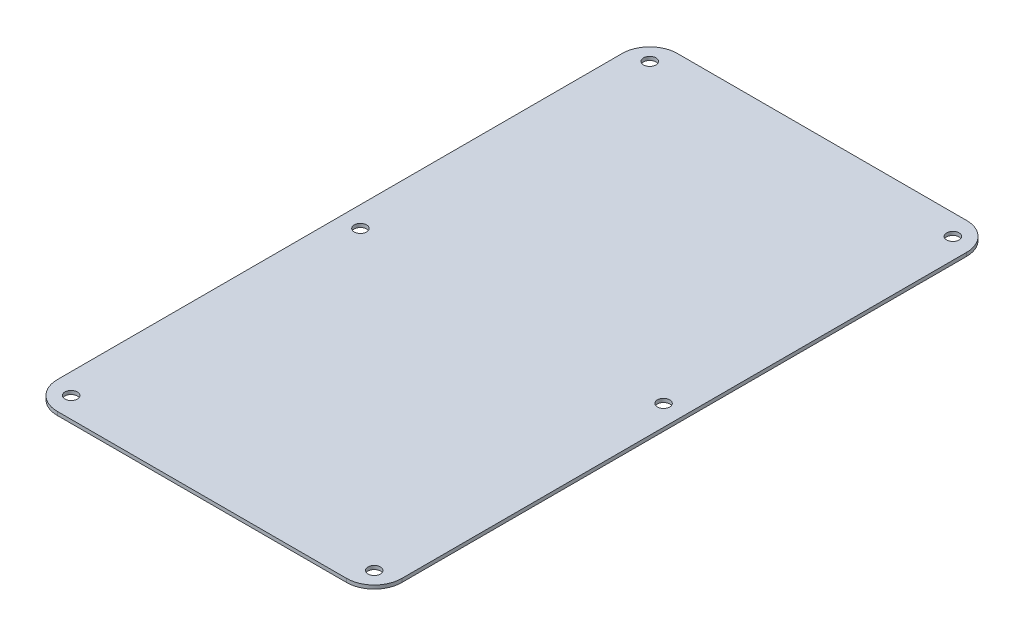
ISO-10303-21;
HEADER;
FILE_DESCRIPTION(('STEP AP214'),'2;1');
FILE_NAME('part.step','',(''),(''),'','','');
FILE_SCHEMA(('AUTOMOTIVE_DESIGN { 1 0 10303 214 1 1 1 1 }'));
ENDSEC;
DATA;
#1=APPLICATION_CONTEXT('core data for automotive mechanical design processes');
#2=APPLICATION_PROTOCOL_DEFINITION('international standard','automotive_design',2000,#1);
#3=PRODUCT_CONTEXT('',#1,'mechanical');
#4=PRODUCT('Part','Part','',(#3));
#5=PRODUCT_RELATED_PRODUCT_CATEGORY('part','',(#4));
#6=PRODUCT_DEFINITION_FORMATION('','',#4);
#7=PRODUCT_DEFINITION_CONTEXT('part definition',#1,'design');
#8=PRODUCT_DEFINITION('design','',#6,#7);
#9=PRODUCT_DEFINITION_SHAPE('','',#8);
#10=(LENGTH_UNIT() NAMED_UNIT(*) SI_UNIT(.MILLI.,.METRE.));
#11=(NAMED_UNIT(*) PLANE_ANGLE_UNIT() SI_UNIT($,.RADIAN.));
#12=(NAMED_UNIT(*) SI_UNIT($,.STERADIAN.) SOLID_ANGLE_UNIT());
#13=UNCERTAINTY_MEASURE_WITH_UNIT(LENGTH_MEASURE(1.E-05),#10,'distance_accuracy_value','');
#14=(GEOMETRIC_REPRESENTATION_CONTEXT(3) GLOBAL_UNCERTAINTY_ASSIGNED_CONTEXT((#13)) GLOBAL_UNIT_ASSIGNED_CONTEXT((#10,
#11,#12)) REPRESENTATION_CONTEXT('',''));
#15=CARTESIAN_POINT('',(0.,0.,0.));
#16=DIRECTION('',(0.,0.,1.));
#17=DIRECTION('',(1.,0.,0.));
#18=AXIS2_PLACEMENT_3D('',#15,#16,#17);
#19=CARTESIAN_POINT('',(61.3121302892401,-1.3,-121.883580575362));
#20=DIRECTION('',(1.,0.,0.));
#21=DIRECTION('',(0.,0.,-1.));
#22=AXIS2_PLACEMENT_3D('',#19,#20,#21);
#23=PLANE('',#22);
#24=DIRECTION('',(0.,0.,-1.));
#25=VECTOR('',#24,1.);
#26=CARTESIAN_POINT('',(61.3121302892401,-1.3,-121.883580575362));
#27=LINE('',#26,#25);
#28=CARTESIAN_POINT('',(61.3121302892401,-1.3,93.1164194246375));
#29=VERTEX_POINT('',#28);
#30=CARTESIAN_POINT('',(61.3121302892401,-1.3,-111.883580575362));
#31=VERTEX_POINT('',#30);
#32=EDGE_CURVE('E164',#29,#31,#27,.T.);
#33=ORIENTED_EDGE('',*,*,#32,.T.);
#34=DIRECTION('',(0.,1.,0.));
#35=VECTOR('',#34,1.);
#36=CARTESIAN_POINT('',(61.3121302892401,-1.3,-111.883580575362));
#37=LINE('',#36,#35);
#38=CARTESIAN_POINT('',(61.3121302892401,0.,-111.883580575362));
#39=VERTEX_POINT('',#38);
#40=EDGE_CURVE('E157',#31,#39,#37,.T.);
#41=ORIENTED_EDGE('',*,*,#40,.T.);
#42=DIRECTION('',(0.,0.,-1.));
#43=VECTOR('',#42,1.);
#44=CARTESIAN_POINT('',(61.3121302892401,0.,-121.883580575362));
#45=LINE('',#44,#43);
#46=CARTESIAN_POINT('',(61.3121302892401,0.,93.1164194246375));
#47=VERTEX_POINT('',#46);
#48=EDGE_CURVE('E110',#47,#39,#45,.T.);
#49=ORIENTED_EDGE('',*,*,#48,.F.);
#50=DIRECTION('',(0.,1.,0.));
#51=VECTOR('',#50,1.);
#52=CARTESIAN_POINT('',(61.3121302892401,-1.3,93.1164194246375));
#53=LINE('',#52,#51);
#54=EDGE_CURVE('E155',#47,#29,#53,.F.);
#55=ORIENTED_EDGE('',*,*,#54,.T.);
#56=EDGE_LOOP('',(#33,#41,#49,#55));
#57=FACE_BOUND('',#56,.T.);
#58=ADVANCED_FACE('F40',(#57),#23,.T.);
#59=CARTESIAN_POINT('',(-63.6878697107599,-1.3,103.116419424638));
#60=DIRECTION('',(0.,0.,1.));
#61=DIRECTION('',(1.,0.,0.));
#62=AXIS2_PLACEMENT_3D('',#59,#60,#61);
#63=PLANE('',#62);
#64=DIRECTION('',(1.,0.,0.));
#65=VECTOR('',#64,1.);
#66=CARTESIAN_POINT('',(-63.6878697107599,0.,103.116419424638));
#67=LINE('',#66,#65);
#68=CARTESIAN_POINT('',(-53.6878697107599,0.,103.116419424638));
#69=VERTEX_POINT('',#68);
#70=CARTESIAN_POINT('',(51.3121302892401,0.,103.116419424638));
#71=VERTEX_POINT('',#70);
#72=EDGE_CURVE('E138',#69,#71,#67,.T.);
#73=ORIENTED_EDGE('',*,*,#72,.F.);
#74=DIRECTION('',(0.,1.,0.));
#75=VECTOR('',#74,1.);
#76=CARTESIAN_POINT('',(-53.6878697107599,-1.3,103.116419424638));
#77=LINE('',#76,#75);
#78=CARTESIAN_POINT('',(-53.6878697107599,-1.3,103.116419424638));
#79=VERTEX_POINT('',#78);
#80=EDGE_CURVE('E11',#69,#79,#77,.F.);
#81=ORIENTED_EDGE('',*,*,#80,.T.);
#82=DIRECTION('',(1.,0.,0.));
#83=VECTOR('',#82,1.);
#84=CARTESIAN_POINT('',(-63.6878697107599,-1.3,103.116419424638));
#85=LINE('',#84,#83);
#86=CARTESIAN_POINT('',(51.3121302892401,-1.3,103.116419424638));
#87=VERTEX_POINT('',#86);
#88=EDGE_CURVE('E131',#79,#87,#85,.T.);
#89=ORIENTED_EDGE('',*,*,#88,.T.);
#90=DIRECTION('',(0.,1.,0.));
#91=VECTOR('',#90,1.);
#92=CARTESIAN_POINT('',(51.3121302892401,-1.3,103.116419424638));
#93=LINE('',#92,#91);
#94=EDGE_CURVE('E48',#87,#71,#93,.T.);
#95=ORIENTED_EDGE('',*,*,#94,.T.);
#96=EDGE_LOOP('',(#73,#81,#89,#95));
#97=FACE_BOUND('',#96,.T.);
#98=ADVANCED_FACE('F161',(#97),#63,.T.);
#99=CARTESIAN_POINT('',(-63.6878697107599,-1.3,-121.883580575362));
#100=DIRECTION('',(-1.,0.,0.));
#101=DIRECTION('',(0.,0.,1.));
#102=AXIS2_PLACEMENT_3D('',#99,#100,#101);
#103=PLANE('',#102);
#104=DIRECTION('',(0.,0.,1.));
#105=VECTOR('',#104,1.);
#106=CARTESIAN_POINT('',(-63.6878697107599,0.,-121.883580575362));
#107=LINE('',#106,#105);
#108=CARTESIAN_POINT('',(-63.6878697107599,0.,-111.883580575362));
#109=VERTEX_POINT('',#108);
#110=CARTESIAN_POINT('',(-63.6878697107599,0.,93.1164194246375));
#111=VERTEX_POINT('',#110);
#112=EDGE_CURVE('E126',#109,#111,#107,.T.);
#113=ORIENTED_EDGE('',*,*,#112,.F.);
#114=DIRECTION('',(0.,1.,0.));
#115=VECTOR('',#114,1.);
#116=CARTESIAN_POINT('',(-63.6878697107599,-1.3,-111.883580575362));
#117=LINE('',#116,#115);
#118=CARTESIAN_POINT('',(-63.6878697107599,-1.3,-111.883580575362));
#119=VERTEX_POINT('',#118);
#120=EDGE_CURVE('E147',#109,#119,#117,.F.);
#121=ORIENTED_EDGE('',*,*,#120,.T.);
#122=DIRECTION('',(0.,0.,1.));
#123=VECTOR('',#122,1.);
#124=CARTESIAN_POINT('',(-63.6878697107599,-1.3,-121.883580575362));
#125=LINE('',#124,#123);
#126=CARTESIAN_POINT('',(-63.6878697107599,-1.3,93.1164194246375));
#127=VERTEX_POINT('',#126);
#128=EDGE_CURVE('E135',#119,#127,#125,.T.);
#129=ORIENTED_EDGE('',*,*,#128,.T.);
#130=DIRECTION('',(0.,1.,0.));
#131=VECTOR('',#130,1.);
#132=CARTESIAN_POINT('',(-63.6878697107599,-1.3,93.1164194246375));
#133=LINE('',#132,#131);
#134=EDGE_CURVE('E144',#127,#111,#133,.T.);
#135=ORIENTED_EDGE('',*,*,#134,.T.);
#136=EDGE_LOOP('',(#113,#121,#129,#135));
#137=FACE_BOUND('',#136,.T.);
#138=ADVANCED_FACE('F246',(#137),#103,.T.);
#139=CARTESIAN_POINT('',(-63.6878697107599,-1.3,-121.883580575362));
#140=DIRECTION('',(0.,0.,-1.));
#141=DIRECTION('',(-1.,0.,0.));
#142=AXIS2_PLACEMENT_3D('',#139,#140,#141);
#143=PLANE('',#142);
#144=DIRECTION('',(-1.,0.,0.));
#145=VECTOR('',#144,1.);
#146=CARTESIAN_POINT('',(-63.6878697107599,-1.3,-121.883580575362));
#147=LINE('',#146,#145);
#148=CARTESIAN_POINT('',(51.3121302892401,-1.3,-121.883580575362));
#149=VERTEX_POINT('',#148);
#150=CARTESIAN_POINT('',(-53.6878697107599,-1.3,-121.883580575362));
#151=VERTEX_POINT('',#150);
#152=EDGE_CURVE('E166',#149,#151,#147,.T.);
#153=ORIENTED_EDGE('',*,*,#152,.T.);
#154=DIRECTION('',(0.,1.,0.));
#155=VECTOR('',#154,1.);
#156=CARTESIAN_POINT('',(-53.6878697107599,-1.3,-121.883580575362));
#157=LINE('',#156,#155);
#158=CARTESIAN_POINT('',(-53.6878697107599,0.,-121.883580575362));
#159=VERTEX_POINT('',#158);
#160=EDGE_CURVE('E125',#151,#159,#157,.T.);
#161=ORIENTED_EDGE('',*,*,#160,.T.);
#162=DIRECTION('',(-1.,0.,0.));
#163=VECTOR('',#162,1.);
#164=CARTESIAN_POINT('',(-63.6878697107599,0.,-121.883580575362));
#165=LINE('',#164,#163);
#166=CARTESIAN_POINT('',(51.3121302892401,0.,-121.883580575362));
#167=VERTEX_POINT('',#166);
#168=EDGE_CURVE('E108',#167,#159,#165,.T.);
#169=ORIENTED_EDGE('',*,*,#168,.F.);
#170=DIRECTION('',(0.,1.,0.));
#171=VECTOR('',#170,1.);
#172=CARTESIAN_POINT('',(51.3121302892401,-1.3,-121.883580575362));
#173=LINE('',#172,#171);
#174=EDGE_CURVE('E122',#167,#149,#173,.F.);
#175=ORIENTED_EDGE('',*,*,#174,.T.);
#176=EDGE_LOOP('',(#153,#161,#169,#175));
#177=FACE_BOUND('',#176,.T.);
#178=ADVANCED_FACE('F121',(#177),#143,.T.);
#179=CARTESIAN_POINT('',(0.,-1.3,0.));
#180=DIRECTION('',(0.,1.,0.));
#181=DIRECTION('',(0.,0.,1.));
#182=AXIS2_PLACEMENT_3D('',#179,#180,#181);
#183=PLANE('',#182);
#184=CARTESIAN_POINT('',(-56.1878697107599,-1.3,-9.38358057536248));
#185=DIRECTION('',(0.,1.,0.));
#186=DIRECTION('',(0.,0.,1.));
#187=AXIS2_PLACEMENT_3D('',#184,#185,#186);
#188=CIRCLE('',#187,2.25);
#189=CARTESIAN_POINT('',(-56.1878697107599,-1.3,-7.13358057536248));
#190=VERTEX_POINT('',#189);
#191=EDGE_CURVE('E204',#190,#190,#188,.T.);
#192=ORIENTED_EDGE('',*,*,#191,.T.);
#193=EDGE_LOOP('',(#192));
#194=FACE_BOUND('',#193,.T.);
#195=CARTESIAN_POINT('',(53.8121302892401,-1.3,-9.38358057536251));
#196=DIRECTION('',(0.,1.,0.));
#197=DIRECTION('',(0.,0.,1.));
#198=AXIS2_PLACEMENT_3D('',#195,#196,#197);
#199=CIRCLE('',#198,2.25);
#200=CARTESIAN_POINT('',(53.8121302892401,-1.3,-7.13358057536251));
#201=VERTEX_POINT('',#200);
#202=EDGE_CURVE('E198',#201,#201,#199,.T.);
#203=ORIENTED_EDGE('',*,*,#202,.T.);
#204=EDGE_LOOP('',(#203));
#205=FACE_BOUND('',#204,.T.);
#206=CARTESIAN_POINT('',(-56.1878697107599,-1.3,-114.383580575362));
#207=DIRECTION('',(0.,1.,0.));
#208=DIRECTION('',(0.,0.,1.));
#209=AXIS2_PLACEMENT_3D('',#206,#207,#208);
#210=CIRCLE('',#209,2.24999999999997);
#211=CARTESIAN_POINT('',(-56.1878697107599,-1.3,-112.133580575363));
#212=VERTEX_POINT('',#211);
#213=EDGE_CURVE('E192',#212,#212,#210,.T.);
#214=ORIENTED_EDGE('',*,*,#213,.T.);
#215=EDGE_LOOP('',(#214));
#216=FACE_BOUND('',#215,.T.);
#217=CARTESIAN_POINT('',(-56.1878697107599,-1.3,95.6164194246375));
#218=DIRECTION('',(0.,1.,0.));
#219=DIRECTION('',(0.,0.,1.));
#220=AXIS2_PLACEMENT_3D('',#217,#218,#219);
#221=CIRCLE('',#220,2.25);
#222=CARTESIAN_POINT('',(-56.1878697107599,-1.3,97.8664194246375));
#223=VERTEX_POINT('',#222);
#224=EDGE_CURVE('E186',#223,#223,#221,.T.);
#225=ORIENTED_EDGE('',*,*,#224,.T.);
#226=EDGE_LOOP('',(#225));
#227=FACE_BOUND('',#226,.T.);
#228=CARTESIAN_POINT('',(53.8121302892401,-1.3,95.6164194246375));
#229=DIRECTION('',(0.,1.,0.));
#230=DIRECTION('',(0.,0.,1.));
#231=AXIS2_PLACEMENT_3D('',#228,#229,#230);
#232=CIRCLE('',#231,2.25);
#233=CARTESIAN_POINT('',(53.8121302892401,-1.3,97.8664194246375));
#234=VERTEX_POINT('',#233);
#235=EDGE_CURVE('E180',#234,#234,#232,.T.);
#236=ORIENTED_EDGE('',*,*,#235,.T.);
#237=EDGE_LOOP('',(#236));
#238=FACE_BOUND('',#237,.T.);
#239=CARTESIAN_POINT('',(53.8121302892401,-1.3,-114.383580575362));
#240=DIRECTION('',(0.,1.,0.));
#241=DIRECTION('',(0.,0.,1.));
#242=AXIS2_PLACEMENT_3D('',#239,#240,#241);
#243=CIRCLE('',#242,2.25000000000003);
#244=CARTESIAN_POINT('',(53.8121302892401,-1.3,-112.133580575362));
#245=VERTEX_POINT('',#244);
#246=EDGE_CURVE('E170',#245,#245,#243,.T.);
#247=ORIENTED_EDGE('',*,*,#246,.T.);
#248=EDGE_LOOP('',(#247));
#249=FACE_BOUND('',#248,.T.);
#250=ORIENTED_EDGE('',*,*,#128,.F.);
#251=CARTESIAN_POINT('',(-53.6878697107599,-1.3,-111.883580575362));
#252=DIRECTION('',(0.,1.,0.));
#253=DIRECTION('',(0.,0.,1.));
#254=AXIS2_PLACEMENT_3D('',#251,#252,#253);
#255=CIRCLE('',#254,10.);
#256=EDGE_CURVE('E153',#119,#151,#255,.F.);
#257=ORIENTED_EDGE('',*,*,#256,.T.);
#258=ORIENTED_EDGE('',*,*,#152,.F.);
#259=CARTESIAN_POINT('',(51.3121302892401,-1.3,-111.883580575362));
#260=DIRECTION('',(0.,1.,0.));
#261=DIRECTION('',(0.,0.,1.));
#262=AXIS2_PLACEMENT_3D('',#259,#260,#261);
#263=CIRCLE('',#262,10.);
#264=EDGE_CURVE('E130',#149,#31,#263,.F.);
#265=ORIENTED_EDGE('',*,*,#264,.T.);
#266=ORIENTED_EDGE('',*,*,#32,.F.);
#267=CARTESIAN_POINT('',(51.3121302892401,-1.3,93.1164194246375));
#268=DIRECTION('',(0.,1.,0.));
#269=DIRECTION('',(0.,0.,1.));
#270=AXIS2_PLACEMENT_3D('',#267,#268,#269);
#271=CIRCLE('',#270,10.);
#272=EDGE_CURVE('E55',#29,#87,#271,.F.);
#273=ORIENTED_EDGE('',*,*,#272,.T.);
#274=ORIENTED_EDGE('',*,*,#88,.F.);
#275=CARTESIAN_POINT('',(-53.6878697107599,-1.3,93.1164194246375));
#276=DIRECTION('',(0.,1.,0.));
#277=DIRECTION('',(0.,0.,1.));
#278=AXIS2_PLACEMENT_3D('',#275,#276,#277);
#279=CIRCLE('',#278,10.);
#280=EDGE_CURVE('E150',#79,#127,#279,.F.);
#281=ORIENTED_EDGE('',*,*,#280,.T.);
#282=EDGE_LOOP('',(#250,#257,#258,#265,#266,#273,#274,#281));
#283=FACE_BOUND('',#282,.T.);
#284=ADVANCED_FACE('F217',(#194,#205,#216,#227,#238,#249,#283),#183,.F.);
#285=CARTESIAN_POINT('',(0.,0.,0.));
#286=DIRECTION('',(0.,1.,0.));
#287=DIRECTION('',(0.,0.,1.));
#288=AXIS2_PLACEMENT_3D('',#285,#286,#287);
#289=PLANE('',#288);
#290=CARTESIAN_POINT('',(-56.1878697107599,0.,-9.38358057536248));
#291=DIRECTION('',(0.,1.,0.));
#292=DIRECTION('',(0.,0.,1.));
#293=AXIS2_PLACEMENT_3D('',#290,#291,#292);
#294=CIRCLE('',#293,2.25);
#295=CARTESIAN_POINT('',(-56.1878697107599,0.,-7.13358057536248));
#296=VERTEX_POINT('',#295);
#297=EDGE_CURVE('E207',#296,#296,#294,.T.);
#298=ORIENTED_EDGE('',*,*,#297,.F.);
#299=EDGE_LOOP('',(#298));
#300=FACE_BOUND('',#299,.T.);
#301=CARTESIAN_POINT('',(53.8121302892401,0.,-9.38358057536251));
#302=DIRECTION('',(0.,1.,0.));
#303=DIRECTION('',(0.,0.,1.));
#304=AXIS2_PLACEMENT_3D('',#301,#302,#303);
#305=CIRCLE('',#304,2.25);
#306=CARTESIAN_POINT('',(53.8121302892401,0.,-7.13358057536251));
#307=VERTEX_POINT('',#306);
#308=EDGE_CURVE('E201',#307,#307,#305,.T.);
#309=ORIENTED_EDGE('',*,*,#308,.F.);
#310=EDGE_LOOP('',(#309));
#311=FACE_BOUND('',#310,.T.);
#312=CARTESIAN_POINT('',(-56.1878697107599,0.,-114.383580575362));
#313=DIRECTION('',(0.,1.,0.));
#314=DIRECTION('',(0.,0.,1.));
#315=AXIS2_PLACEMENT_3D('',#312,#313,#314);
#316=CIRCLE('',#315,2.24999999999997);
#317=CARTESIAN_POINT('',(-56.1878697107599,0.,-112.133580575363));
#318=VERTEX_POINT('',#317);
#319=EDGE_CURVE('E195',#318,#318,#316,.T.);
#320=ORIENTED_EDGE('',*,*,#319,.F.);
#321=EDGE_LOOP('',(#320));
#322=FACE_BOUND('',#321,.T.);
#323=CARTESIAN_POINT('',(-56.1878697107599,0.,95.6164194246375));
#324=DIRECTION('',(0.,1.,0.));
#325=DIRECTION('',(0.,0.,1.));
#326=AXIS2_PLACEMENT_3D('',#323,#324,#325);
#327=CIRCLE('',#326,2.25);
#328=CARTESIAN_POINT('',(-56.1878697107599,0.,97.8664194246375));
#329=VERTEX_POINT('',#328);
#330=EDGE_CURVE('E189',#329,#329,#327,.T.);
#331=ORIENTED_EDGE('',*,*,#330,.F.);
#332=EDGE_LOOP('',(#331));
#333=FACE_BOUND('',#332,.T.);
#334=CARTESIAN_POINT('',(53.8121302892401,0.,95.6164194246375));
#335=DIRECTION('',(0.,1.,0.));
#336=DIRECTION('',(0.,0.,1.));
#337=AXIS2_PLACEMENT_3D('',#334,#335,#336);
#338=CIRCLE('',#337,2.25);
#339=CARTESIAN_POINT('',(53.8121302892401,0.,97.8664194246375));
#340=VERTEX_POINT('',#339);
#341=EDGE_CURVE('E183',#340,#340,#338,.T.);
#342=ORIENTED_EDGE('',*,*,#341,.F.);
#343=EDGE_LOOP('',(#342));
#344=FACE_BOUND('',#343,.T.);
#345=CARTESIAN_POINT('',(53.8121302892401,0.,-114.383580575362));
#346=DIRECTION('',(0.,1.,0.));
#347=DIRECTION('',(0.,0.,1.));
#348=AXIS2_PLACEMENT_3D('',#345,#346,#347);
#349=CIRCLE('',#348,2.25000000000003);
#350=CARTESIAN_POINT('',(53.8121302892401,0.,-112.133580575362));
#351=VERTEX_POINT('',#350);
#352=EDGE_CURVE('E177',#351,#351,#349,.T.);
#353=ORIENTED_EDGE('',*,*,#352,.F.);
#354=EDGE_LOOP('',(#353));
#355=FACE_BOUND('',#354,.T.);
#356=ORIENTED_EDGE('',*,*,#168,.T.);
#357=CARTESIAN_POINT('',(-53.6878697107599,0.,-111.883580575362));
#358=DIRECTION('',(0.,1.,0.));
#359=DIRECTION('',(0.,0.,1.));
#360=AXIS2_PLACEMENT_3D('',#357,#358,#359);
#361=CIRCLE('',#360,10.);
#362=EDGE_CURVE('E115',#159,#109,#361,.T.);
#363=ORIENTED_EDGE('',*,*,#362,.T.);
#364=ORIENTED_EDGE('',*,*,#112,.T.);
#365=CARTESIAN_POINT('',(-53.6878697107599,0.,93.1164194246375));
#366=DIRECTION('',(0.,1.,0.));
#367=DIRECTION('',(0.,0.,1.));
#368=AXIS2_PLACEMENT_3D('',#365,#366,#367);
#369=CIRCLE('',#368,10.);
#370=EDGE_CURVE('E116',#111,#69,#369,.T.);
#371=ORIENTED_EDGE('',*,*,#370,.T.);
#372=ORIENTED_EDGE('',*,*,#72,.T.);
#373=CARTESIAN_POINT('',(51.3121302892401,0.,93.1164194246375));
#374=DIRECTION('',(0.,1.,0.));
#375=DIRECTION('',(0.,0.,1.));
#376=AXIS2_PLACEMENT_3D('',#373,#374,#375);
#377=CIRCLE('',#376,10.);
#378=EDGE_CURVE('E133',#71,#47,#377,.T.);
#379=ORIENTED_EDGE('',*,*,#378,.T.);
#380=ORIENTED_EDGE('',*,*,#48,.T.);
#381=CARTESIAN_POINT('',(51.3121302892401,0.,-111.883580575362));
#382=DIRECTION('',(0.,1.,0.));
#383=DIRECTION('',(0.,0.,1.));
#384=AXIS2_PLACEMENT_3D('',#381,#382,#383);
#385=CIRCLE('',#384,10.);
#386=EDGE_CURVE('E105',#39,#167,#385,.T.);
#387=ORIENTED_EDGE('',*,*,#386,.T.);
#388=EDGE_LOOP('',(#356,#363,#364,#371,#372,#379,#380,#387));
#389=FACE_BOUND('',#388,.T.);
#390=ADVANCED_FACE('F107',(#300,#311,#322,#333,#344,#355,#389),#289,.T.);
#391=CARTESIAN_POINT('',(53.8121302892401,-10.,-114.383580575362));
#392=DIRECTION('',(0.,1.,0.));
#393=DIRECTION('',(0.,0.,1.));
#394=AXIS2_PLACEMENT_3D('',#391,#392,#393);
#395=CYLINDRICAL_SURFACE('',#394,2.25000000000003);
#396=ORIENTED_EDGE('',*,*,#352,.T.);
#397=EDGE_LOOP('',(#396));
#398=FACE_BOUND('',#397,.T.);
#399=ORIENTED_EDGE('',*,*,#246,.F.);
#400=EDGE_LOOP('',(#399));
#401=FACE_BOUND('',#400,.T.);
#402=ADVANCED_FACE('F216',(#398,#401),#395,.F.);
#403=CARTESIAN_POINT('',(53.8121302892401,-10.,95.6164194246375));
#404=DIRECTION('',(0.,1.,0.));
#405=DIRECTION('',(0.,0.,1.));
#406=AXIS2_PLACEMENT_3D('',#403,#404,#405);
#407=CYLINDRICAL_SURFACE('',#406,2.25);
#408=ORIENTED_EDGE('',*,*,#341,.T.);
#409=EDGE_LOOP('',(#408));
#410=FACE_BOUND('',#409,.T.);
#411=ORIENTED_EDGE('',*,*,#235,.F.);
#412=EDGE_LOOP('',(#411));
#413=FACE_BOUND('',#412,.T.);
#414=ADVANCED_FACE('F231',(#410,#413),#407,.F.);
#415=CARTESIAN_POINT('',(-56.1878697107599,-10.,95.6164194246375));
#416=DIRECTION('',(0.,1.,0.));
#417=DIRECTION('',(0.,0.,1.));
#418=AXIS2_PLACEMENT_3D('',#415,#416,#417);
#419=CYLINDRICAL_SURFACE('',#418,2.25);
#420=ORIENTED_EDGE('',*,*,#330,.T.);
#421=EDGE_LOOP('',(#420));
#422=FACE_BOUND('',#421,.T.);
#423=ORIENTED_EDGE('',*,*,#224,.F.);
#424=EDGE_LOOP('',(#423));
#425=FACE_BOUND('',#424,.T.);
#426=ADVANCED_FACE('F280',(#422,#425),#419,.F.);
#427=CARTESIAN_POINT('',(-56.1878697107599,-10.,-114.383580575362));
#428=DIRECTION('',(0.,1.,0.));
#429=DIRECTION('',(0.,0.,1.));
#430=AXIS2_PLACEMENT_3D('',#427,#428,#429);
#431=CYLINDRICAL_SURFACE('',#430,2.24999999999997);
#432=ORIENTED_EDGE('',*,*,#319,.T.);
#433=EDGE_LOOP('',(#432));
#434=FACE_BOUND('',#433,.T.);
#435=ORIENTED_EDGE('',*,*,#213,.F.);
#436=EDGE_LOOP('',(#435));
#437=FACE_BOUND('',#436,.T.);
#438=ADVANCED_FACE('F274',(#434,#437),#431,.F.);
#439=CARTESIAN_POINT('',(53.8121302892401,-10.,-9.38358057536251));
#440=DIRECTION('',(0.,1.,0.));
#441=DIRECTION('',(0.,0.,1.));
#442=AXIS2_PLACEMENT_3D('',#439,#440,#441);
#443=CYLINDRICAL_SURFACE('',#442,2.25);
#444=ORIENTED_EDGE('',*,*,#308,.T.);
#445=EDGE_LOOP('',(#444));
#446=FACE_BOUND('',#445,.T.);
#447=ORIENTED_EDGE('',*,*,#202,.F.);
#448=EDGE_LOOP('',(#447));
#449=FACE_BOUND('',#448,.T.);
#450=ADVANCED_FACE('F269',(#446,#449),#443,.F.);
#451=CARTESIAN_POINT('',(-56.1878697107599,-10.,-9.38358057536248));
#452=DIRECTION('',(0.,1.,0.));
#453=DIRECTION('',(0.,0.,1.));
#454=AXIS2_PLACEMENT_3D('',#451,#452,#453);
#455=CYLINDRICAL_SURFACE('',#454,2.25);
#456=ORIENTED_EDGE('',*,*,#297,.T.);
#457=EDGE_LOOP('',(#456));
#458=FACE_BOUND('',#457,.T.);
#459=ORIENTED_EDGE('',*,*,#191,.F.);
#460=EDGE_LOOP('',(#459));
#461=FACE_BOUND('',#460,.T.);
#462=ADVANCED_FACE('F211',(#458,#461),#455,.F.);
#463=CARTESIAN_POINT('',(-53.6878697107599,-1.3,-111.883580575362));
#464=DIRECTION('',(0.,1.,0.));
#465=DIRECTION('',(0.,0.,1.));
#466=AXIS2_PLACEMENT_3D('',#463,#464,#465);
#467=CYLINDRICAL_SURFACE('',#466,10.);
#468=ORIENTED_EDGE('',*,*,#256,.F.);
#469=ORIENTED_EDGE('',*,*,#120,.F.);
#470=ORIENTED_EDGE('',*,*,#362,.F.);
#471=ORIENTED_EDGE('',*,*,#160,.F.);
#472=EDGE_LOOP('',(#468,#469,#470,#471));
#473=FACE_BOUND('',#472,.T.);
#474=ADVANCED_FACE('F245',(#473),#467,.T.);
#475=CARTESIAN_POINT('',(51.3121302892401,-1.3,-111.883580575362));
#476=DIRECTION('',(0.,1.,0.));
#477=DIRECTION('',(0.,0.,1.));
#478=AXIS2_PLACEMENT_3D('',#475,#476,#477);
#479=CYLINDRICAL_SURFACE('',#478,10.);
#480=ORIENTED_EDGE('',*,*,#264,.F.);
#481=ORIENTED_EDGE('',*,*,#174,.F.);
#482=ORIENTED_EDGE('',*,*,#386,.F.);
#483=ORIENTED_EDGE('',*,*,#40,.F.);
#484=EDGE_LOOP('',(#480,#481,#482,#483));
#485=FACE_BOUND('',#484,.T.);
#486=ADVANCED_FACE('F129',(#485),#479,.T.);
#487=CARTESIAN_POINT('',(-53.6878697107599,-1.3,93.1164194246375));
#488=DIRECTION('',(0.,1.,0.));
#489=DIRECTION('',(0.,0.,1.));
#490=AXIS2_PLACEMENT_3D('',#487,#488,#489);
#491=CYLINDRICAL_SURFACE('',#490,10.);
#492=ORIENTED_EDGE('',*,*,#280,.F.);
#493=ORIENTED_EDGE('',*,*,#80,.F.);
#494=ORIENTED_EDGE('',*,*,#370,.F.);
#495=ORIENTED_EDGE('',*,*,#134,.F.);
#496=EDGE_LOOP('',(#492,#493,#494,#495));
#497=FACE_BOUND('',#496,.T.);
#498=ADVANCED_FACE('F248',(#497),#491,.T.);
#499=CARTESIAN_POINT('',(51.3121302892401,-1.3,93.1164194246375));
#500=DIRECTION('',(0.,1.,0.));
#501=DIRECTION('',(0.,0.,1.));
#502=AXIS2_PLACEMENT_3D('',#499,#500,#501);
#503=CYLINDRICAL_SURFACE('',#502,10.);
#504=ORIENTED_EDGE('',*,*,#272,.F.);
#505=ORIENTED_EDGE('',*,*,#54,.F.);
#506=ORIENTED_EDGE('',*,*,#378,.F.);
#507=ORIENTED_EDGE('',*,*,#94,.F.);
#508=EDGE_LOOP('',(#504,#505,#506,#507));
#509=FACE_BOUND('',#508,.T.);
#510=ADVANCED_FACE('F42',(#509),#503,.T.);
#511=CLOSED_SHELL('',(#58,#98,#138,#178,#284,#390,#402,#414,#426,#438,#450,#462,#474,#486,#498,#510));
#512=MANIFOLD_SOLID_BREP('B2',#511);
#513=ADVANCED_BREP_SHAPE_REPRESENTATION('',(#18,#512),#14);
#514=SHAPE_DEFINITION_REPRESENTATION(#9,#513);
ENDSEC;
END-ISO-10303-21;
